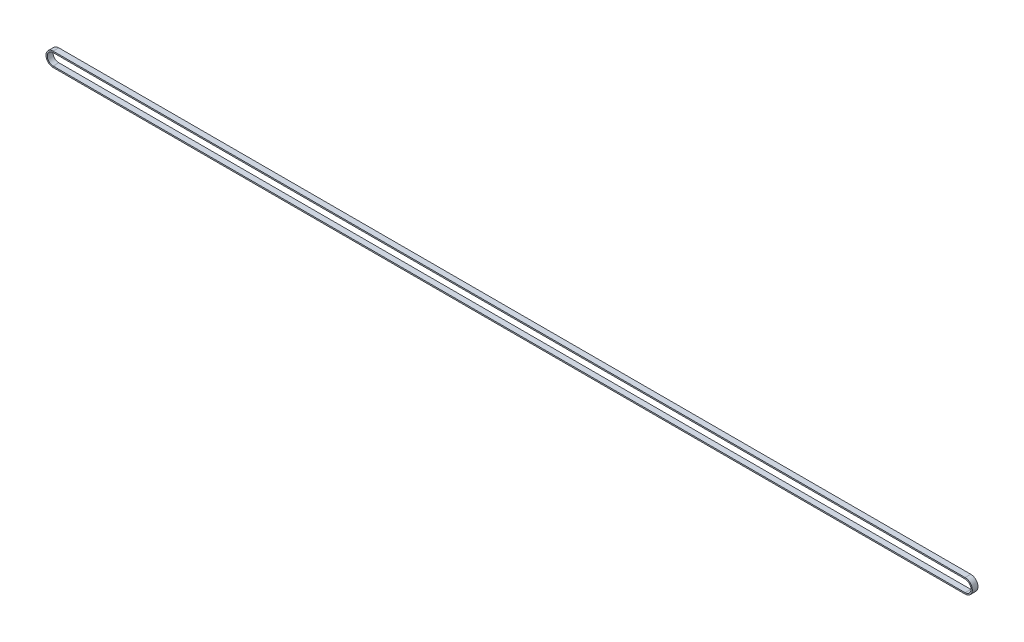
ISO-10303-21;
HEADER;
FILE_DESCRIPTION(('STEP AP214'),'2;1');
FILE_NAME('part.step','',(''),(''),'','','');
FILE_SCHEMA(('AUTOMOTIVE_DESIGN { 1 0 10303 214 1 1 1 1 }'));
ENDSEC;
DATA;
#1=APPLICATION_CONTEXT('core data for automotive mechanical design processes');
#2=APPLICATION_PROTOCOL_DEFINITION('international standard','automotive_design',2000,#1);
#3=PRODUCT_CONTEXT('',#1,'mechanical');
#4=PRODUCT('Part','Part','',(#3));
#5=PRODUCT_RELATED_PRODUCT_CATEGORY('part','',(#4));
#6=PRODUCT_DEFINITION_FORMATION('','',#4);
#7=PRODUCT_DEFINITION_CONTEXT('part definition',#1,'design');
#8=PRODUCT_DEFINITION('design','',#6,#7);
#9=PRODUCT_DEFINITION_SHAPE('','',#8);
#10=(LENGTH_UNIT() NAMED_UNIT(*) SI_UNIT(.MILLI.,.METRE.));
#11=(NAMED_UNIT(*) PLANE_ANGLE_UNIT() SI_UNIT($,.RADIAN.));
#12=(NAMED_UNIT(*) SI_UNIT($,.STERADIAN.) SOLID_ANGLE_UNIT());
#13=UNCERTAINTY_MEASURE_WITH_UNIT(LENGTH_MEASURE(1.E-05),#10,'distance_accuracy_value','');
#14=(GEOMETRIC_REPRESENTATION_CONTEXT(3) GLOBAL_UNCERTAINTY_ASSIGNED_CONTEXT((#13)) GLOBAL_UNIT_ASSIGNED_CONTEXT((#10,
#11,#12)) REPRESENTATION_CONTEXT('',''));
#15=CARTESIAN_POINT('',(0.,0.,0.));
#16=DIRECTION('',(0.,0.,1.));
#17=DIRECTION('',(1.,0.,0.));
#18=AXIS2_PLACEMENT_3D('',#15,#16,#17);
#19=CARTESIAN_POINT('',(9.99200722162641E-13,5.72458747072346E-13,3.));
#20=DIRECTION('',(0.,0.,-1.));
#21=DIRECTION('',(-1.,0.,0.));
#22=AXIS2_PLACEMENT_3D('',#19,#20,#21);
#23=PLANE('',#22);
#24=CARTESIAN_POINT('',(9.99200722162641E-13,5.72458747072346E-13,3.));
#25=DIRECTION('',(0.,0.,1.));
#26=DIRECTION('',(-1.,0.,0.));
#27=AXIS2_PLACEMENT_3D('',#24,#25,#26);
#28=CIRCLE('',#27,7.49);
#29=CARTESIAN_POINT('',(-0.000779396472865312,7.48999995944925,3.));
#30=VERTEX_POINT('',#29);
#31=CARTESIAN_POINT('',(-0.000779396449174424,-7.48999995944811,3.));
#32=VERTEX_POINT('',#31);
#33=EDGE_CURVE('E140',#30,#32,#28,.T.);
#34=ORIENTED_EDGE('',*,*,#33,.T.);
#35=DIRECTION('',(0.999999994585849,-0.000104059126272446,0.));
#36=VECTOR('',#35,1.);
#37=CARTESIAN_POINT('',(960.98348595384,-7.58999914300344,3.));
#38=LINE('',#37,#36);
#39=CARTESIAN_POINT('',(960.98348595384,-7.58999914300344,3.));
#40=VERTEX_POINT('',#39);
#41=EDGE_CURVE('E143',#32,#40,#38,.T.);
#42=ORIENTED_EDGE('',*,*,#41,.T.);
#43=CARTESIAN_POINT('',(960.984275756032,1.52054237256838E-09,3.));
#44=DIRECTION('',(0.,0.,1.));
#45=DIRECTION('',(-1.,0.,0.));
#46=AXIS2_PLACEMENT_3D('',#43,#44,#45);
#47=CIRCLE('',#46,7.58999877468946);
#48=CARTESIAN_POINT('',(960.983485953858,7.58999873511727,3.));
#49=VERTEX_POINT('',#48);
#50=EDGE_CURVE('E146',#40,#49,#47,.T.);
#51=ORIENTED_EDGE('',*,*,#50,.T.);
#52=DIRECTION('',(-0.999999994585938,-0.000104058274214226,0.));
#53=VECTOR('',#52,1.);
#54=CARTESIAN_POINT('',(-0.000779396472865312,7.48999995944925,3.));
#55=LINE('',#54,#53);
#56=EDGE_CURVE('E148',#49,#30,#55,.T.);
#57=ORIENTED_EDGE('',*,*,#56,.T.);
#58=EDGE_LOOP('',(#34,#42,#51,#57));
#59=FACE_BOUND('',#58,.T.);
#60=CARTESIAN_POINT('',(9.99200722162641E-13,5.72458747072346E-13,3.));
#61=DIRECTION('',(0.,0.,1.));
#62=DIRECTION('',(-1.,0.,0.));
#63=AXIS2_PLACEMENT_3D('',#60,#61,#62);
#64=CIRCLE('',#63,6.11);
#65=CARTESIAN_POINT('',(-0.000635796054449721,6.10999996692065,3.));
#66=VERTEX_POINT('',#65);
#67=CARTESIAN_POINT('',(-0.000635796035121573,-6.10999996691951,3.));
#68=VERTEX_POINT('',#67);
#69=EDGE_CURVE('E104',#66,#68,#64,.T.);
#70=ORIENTED_EDGE('',*,*,#69,.F.);
#71=DIRECTION('',(-0.999999994585938,-0.000104058274214226,0.));
#72=VECTOR('',#71,1.);
#73=CARTESIAN_POINT('',(-0.000635796054449721,6.10999996692065,3.));
#74=LINE('',#73,#72);
#75=CARTESIAN_POINT('',(960.983629554319,6.20999833166144,3.));
#76=VERTEX_POINT('',#75);
#77=EDGE_CURVE('E126',#76,#66,#74,.T.);
#78=ORIENTED_EDGE('',*,*,#77,.F.);
#79=CARTESIAN_POINT('',(960.984275756032,1.52054237256838E-09,3.));
#80=DIRECTION('',(0.,0.,1.));
#81=DIRECTION('',(-1.,0.,0.));
#82=AXIS2_PLACEMENT_3D('',#79,#80,#81);
#83=CIRCLE('',#82,6.20999836376221);
#84=CARTESIAN_POINT('',(960.983629554339,-6.20999832862035,3.));
#85=VERTEX_POINT('',#84);
#86=EDGE_CURVE('E124',#85,#76,#83,.T.);
#87=ORIENTED_EDGE('',*,*,#86,.F.);
#88=DIRECTION('',(0.999999994585938,-0.000104058271050866,0.));
#89=VECTOR('',#88,1.);
#90=CARTESIAN_POINT('',(960.983629554339,-6.20999832862035,3.));
#91=LINE('',#90,#89);
#92=EDGE_CURVE('E112',#68,#85,#91,.T.);
#93=ORIENTED_EDGE('',*,*,#92,.F.);
#94=EDGE_LOOP('',(#70,#78,#87,#93));
#95=FACE_BOUND('',#94,.T.);
#96=ADVANCED_FACE('F39',(#59,#95),#23,.F.);
#97=CARTESIAN_POINT('',(9.99200722162641E-13,5.72458747072346E-13,-3.));
#98=DIRECTION('',(0.,0.,-1.));
#99=DIRECTION('',(-1.,0.,0.));
#100=AXIS2_PLACEMENT_3D('',#97,#98,#99);
#101=PLANE('',#100);
#102=CARTESIAN_POINT('',(9.99200722162641E-13,5.72458747072346E-13,-3.));
#103=DIRECTION('',(0.,0.,1.));
#104=DIRECTION('',(-1.,0.,0.));
#105=AXIS2_PLACEMENT_3D('',#102,#103,#104);
#106=CIRCLE('',#105,7.49);
#107=CARTESIAN_POINT('',(-0.000779396472865312,7.48999995944925,-3.));
#108=VERTEX_POINT('',#107);
#109=CARTESIAN_POINT('',(-0.000779396449174424,-7.48999995944811,-3.));
#110=VERTEX_POINT('',#109);
#111=EDGE_CURVE('E120',#108,#110,#106,.T.);
#112=ORIENTED_EDGE('',*,*,#111,.F.);
#113=DIRECTION('',(-0.999999994585938,-0.000104058274214226,0.));
#114=VECTOR('',#113,1.);
#115=CARTESIAN_POINT('',(-0.000779396472865312,7.48999995944925,-3.));
#116=LINE('',#115,#114);
#117=CARTESIAN_POINT('',(960.983485953858,7.58999873511727,-3.));
#118=VERTEX_POINT('',#117);
#119=EDGE_CURVE('E144',#118,#108,#116,.T.);
#120=ORIENTED_EDGE('',*,*,#119,.F.);
#121=CARTESIAN_POINT('',(960.984275756032,1.52054237256838E-09,-3.));
#122=DIRECTION('',(0.,0.,1.));
#123=DIRECTION('',(-1.,0.,0.));
#124=AXIS2_PLACEMENT_3D('',#121,#122,#123);
#125=CIRCLE('',#124,7.58999877468946);
#126=CARTESIAN_POINT('',(960.98348595384,-7.58999914300344,-3.));
#127=VERTEX_POINT('',#126);
#128=EDGE_CURVE('E155',#127,#118,#125,.T.);
#129=ORIENTED_EDGE('',*,*,#128,.F.);
#130=DIRECTION('',(0.999999994585849,-0.000104059126272446,0.));
#131=VECTOR('',#130,1.);
#132=CARTESIAN_POINT('',(960.98348595384,-7.58999914300344,-3.));
#133=LINE('',#132,#131);
#134=EDGE_CURVE('E153',#110,#127,#133,.T.);
#135=ORIENTED_EDGE('',*,*,#134,.F.);
#136=EDGE_LOOP('',(#112,#120,#129,#135));
#137=FACE_BOUND('',#136,.T.);
#138=DIRECTION('',(-0.999999994585938,-0.000104058274214226,0.));
#139=VECTOR('',#138,1.);
#140=CARTESIAN_POINT('',(-0.000635796054449721,6.10999996692065,-3.));
#141=LINE('',#140,#139);
#142=CARTESIAN_POINT('',(960.983629554319,6.20999833166144,-3.));
#143=VERTEX_POINT('',#142);
#144=CARTESIAN_POINT('',(-0.000635796054449721,6.10999996692065,-3.));
#145=VERTEX_POINT('',#144);
#146=EDGE_CURVE('E113',#143,#145,#141,.T.);
#147=ORIENTED_EDGE('',*,*,#146,.T.);
#148=CARTESIAN_POINT('',(9.99200722162641E-13,5.72458747072346E-13,-3.));
#149=DIRECTION('',(0.,0.,1.));
#150=DIRECTION('',(-1.,0.,0.));
#151=AXIS2_PLACEMENT_3D('',#148,#149,#150);
#152=CIRCLE('',#151,6.11);
#153=CARTESIAN_POINT('',(-0.000635796035121573,-6.10999996691951,-3.));
#154=VERTEX_POINT('',#153);
#155=EDGE_CURVE('E62',#145,#154,#152,.T.);
#156=ORIENTED_EDGE('',*,*,#155,.T.);
#157=DIRECTION('',(0.999999994585938,-0.000104058271050866,0.));
#158=VECTOR('',#157,1.);
#159=CARTESIAN_POINT('',(960.983629554339,-6.20999832862035,-3.));
#160=LINE('',#159,#158);
#161=CARTESIAN_POINT('',(960.983629554339,-6.20999832862035,-3.));
#162=VERTEX_POINT('',#161);
#163=EDGE_CURVE('E119',#154,#162,#160,.T.);
#164=ORIENTED_EDGE('',*,*,#163,.T.);
#165=CARTESIAN_POINT('',(960.984275756032,1.52054237256838E-09,-3.));
#166=DIRECTION('',(0.,0.,1.));
#167=DIRECTION('',(-1.,0.,0.));
#168=AXIS2_PLACEMENT_3D('',#165,#166,#167);
#169=CIRCLE('',#168,6.20999836376221);
#170=EDGE_CURVE('E132',#162,#143,#169,.T.);
#171=ORIENTED_EDGE('',*,*,#170,.T.);
#172=EDGE_LOOP('',(#147,#156,#164,#171));
#173=FACE_BOUND('',#172,.T.);
#174=ADVANCED_FACE('F173',(#137,#173),#101,.T.);
#175=CARTESIAN_POINT('',(9.99200722162641E-13,5.72458747072346E-13,3.));
#176=DIRECTION('',(0.,0.,-1.));
#177=DIRECTION('',(-1.,0.,0.));
#178=AXIS2_PLACEMENT_3D('',#175,#176,#177);
#179=CYLINDRICAL_SURFACE('',#178,7.49);
#180=ORIENTED_EDGE('',*,*,#111,.T.);
#181=DIRECTION('',(0.,0.,-1.));
#182=VECTOR('',#181,1.);
#183=CARTESIAN_POINT('',(-0.000779396449174424,-7.48999995944811,3.));
#184=LINE('',#183,#182);
#185=EDGE_CURVE('E11',#32,#110,#184,.T.);
#186=ORIENTED_EDGE('',*,*,#185,.F.);
#187=ORIENTED_EDGE('',*,*,#33,.F.);
#188=DIRECTION('',(0.,0.,-1.));
#189=VECTOR('',#188,1.);
#190=CARTESIAN_POINT('',(-0.000779396472865312,7.48999995944925,3.));
#191=LINE('',#190,#189);
#192=EDGE_CURVE('E150',#30,#108,#191,.T.);
#193=ORIENTED_EDGE('',*,*,#192,.T.);
#194=EDGE_LOOP('',(#180,#186,#187,#193));
#195=FACE_BOUND('',#194,.T.);
#196=ADVANCED_FACE('F41',(#195),#179,.T.);
#197=CARTESIAN_POINT('',(960.98348595384,-7.58999914300344,3.));
#198=DIRECTION('',(0.000104059126272446,0.999999994585849,0.));
#199=DIRECTION('',(-0.999999994585849,0.000104059126272446,0.));
#200=AXIS2_PLACEMENT_3D('',#197,#198,#199);
#201=PLANE('',#200);
#202=ORIENTED_EDGE('',*,*,#134,.T.);
#203=DIRECTION('',(0.,0.,-1.));
#204=VECTOR('',#203,1.);
#205=CARTESIAN_POINT('',(960.98348595384,-7.58999914300344,3.));
#206=LINE('',#205,#204);
#207=EDGE_CURVE('E47',#40,#127,#206,.T.);
#208=ORIENTED_EDGE('',*,*,#207,.F.);
#209=ORIENTED_EDGE('',*,*,#41,.F.);
#210=ORIENTED_EDGE('',*,*,#185,.T.);
#211=EDGE_LOOP('',(#202,#208,#209,#210));
#212=FACE_BOUND('',#211,.T.);
#213=ADVANCED_FACE('F183',(#212),#201,.F.);
#214=CARTESIAN_POINT('',(960.984275756032,1.52054237256838E-09,3.));
#215=DIRECTION('',(0.,0.,-1.));
#216=DIRECTION('',(-1.,0.,0.));
#217=AXIS2_PLACEMENT_3D('',#214,#215,#216);
#218=CYLINDRICAL_SURFACE('',#217,7.58999877468946);
#219=ORIENTED_EDGE('',*,*,#128,.T.);
#220=DIRECTION('',(0.,0.,-1.));
#221=VECTOR('',#220,1.);
#222=CARTESIAN_POINT('',(960.983485953858,7.58999873511727,3.));
#223=LINE('',#222,#221);
#224=EDGE_CURVE('E160',#49,#118,#223,.T.);
#225=ORIENTED_EDGE('',*,*,#224,.F.);
#226=ORIENTED_EDGE('',*,*,#50,.F.);
#227=ORIENTED_EDGE('',*,*,#207,.T.);
#228=EDGE_LOOP('',(#219,#225,#226,#227));
#229=FACE_BOUND('',#228,.T.);
#230=ADVANCED_FACE('F167',(#229),#218,.T.);
#231=CARTESIAN_POINT('',(-0.000779396472865312,7.48999995944925,3.));
#232=DIRECTION('',(0.000104058274214226,-0.999999994585938,0.));
#233=DIRECTION('',(0.999999994585938,0.000104058274214226,0.));
#234=AXIS2_PLACEMENT_3D('',#231,#232,#233);
#235=PLANE('',#234);
#236=ORIENTED_EDGE('',*,*,#119,.T.);
#237=ORIENTED_EDGE('',*,*,#192,.F.);
#238=ORIENTED_EDGE('',*,*,#56,.F.);
#239=ORIENTED_EDGE('',*,*,#224,.T.);
#240=EDGE_LOOP('',(#236,#237,#238,#239));
#241=FACE_BOUND('',#240,.T.);
#242=ADVANCED_FACE('F177',(#241),#235,.F.);
#243=CARTESIAN_POINT('',(9.99200722162641E-13,5.72458747072346E-13,3.));
#244=DIRECTION('',(0.,0.,-1.));
#245=DIRECTION('',(-1.,0.,0.));
#246=AXIS2_PLACEMENT_3D('',#243,#244,#245);
#247=CYLINDRICAL_SURFACE('',#246,6.11);
#248=ORIENTED_EDGE('',*,*,#155,.F.);
#249=DIRECTION('',(0.,0.,-1.));
#250=VECTOR('',#249,1.);
#251=CARTESIAN_POINT('',(-0.000635796054449721,6.10999996692065,3.));
#252=LINE('',#251,#250);
#253=EDGE_CURVE('E108',#66,#145,#252,.T.);
#254=ORIENTED_EDGE('',*,*,#253,.F.);
#255=ORIENTED_EDGE('',*,*,#69,.T.);
#256=DIRECTION('',(0.,0.,-1.));
#257=VECTOR('',#256,1.);
#258=CARTESIAN_POINT('',(-0.000635796035121573,-6.10999996691951,3.));
#259=LINE('',#258,#257);
#260=EDGE_CURVE('E107',#68,#154,#259,.T.);
#261=ORIENTED_EDGE('',*,*,#260,.T.);
#262=EDGE_LOOP('',(#248,#254,#255,#261));
#263=FACE_BOUND('',#262,.T.);
#264=ADVANCED_FACE('F106',(#263),#247,.F.);
#265=CARTESIAN_POINT('',(960.983629554339,-6.20999832862035,3.));
#266=DIRECTION('',(0.000104058271050866,0.999999994585938,0.));
#267=DIRECTION('',(-0.999999994585938,0.000104058271050866,0.));
#268=AXIS2_PLACEMENT_3D('',#265,#266,#267);
#269=PLANE('',#268);
#270=ORIENTED_EDGE('',*,*,#163,.F.);
#271=ORIENTED_EDGE('',*,*,#260,.F.);
#272=ORIENTED_EDGE('',*,*,#92,.T.);
#273=DIRECTION('',(0.,0.,-1.));
#274=VECTOR('',#273,1.);
#275=CARTESIAN_POINT('',(960.983629554339,-6.20999832862035,3.));
#276=LINE('',#275,#274);
#277=EDGE_CURVE('E121',#85,#162,#276,.T.);
#278=ORIENTED_EDGE('',*,*,#277,.T.);
#279=EDGE_LOOP('',(#270,#271,#272,#278));
#280=FACE_BOUND('',#279,.T.);
#281=ADVANCED_FACE('F116',(#280),#269,.T.);
#282=CARTESIAN_POINT('',(960.984275756032,1.52054237256838E-09,3.));
#283=DIRECTION('',(0.,0.,-1.));
#284=DIRECTION('',(-1.,0.,0.));
#285=AXIS2_PLACEMENT_3D('',#282,#283,#284);
#286=CYLINDRICAL_SURFACE('',#285,6.20999836376221);
#287=ORIENTED_EDGE('',*,*,#170,.F.);
#288=ORIENTED_EDGE('',*,*,#277,.F.);
#289=ORIENTED_EDGE('',*,*,#86,.T.);
#290=DIRECTION('',(0.,0.,-1.));
#291=VECTOR('',#290,1.);
#292=CARTESIAN_POINT('',(960.983629554319,6.20999833166144,3.));
#293=LINE('',#292,#291);
#294=EDGE_CURVE('E54',#76,#143,#293,.T.);
#295=ORIENTED_EDGE('',*,*,#294,.T.);
#296=EDGE_LOOP('',(#287,#288,#289,#295));
#297=FACE_BOUND('',#296,.T.);
#298=ADVANCED_FACE('F206',(#297),#286,.F.);
#299=CARTESIAN_POINT('',(-0.000635796054449721,6.10999996692065,3.));
#300=DIRECTION('',(0.000104058274214226,-0.999999994585938,0.));
#301=DIRECTION('',(0.999999994585938,0.000104058274214226,0.));
#302=AXIS2_PLACEMENT_3D('',#299,#300,#301);
#303=PLANE('',#302);
#304=ORIENTED_EDGE('',*,*,#146,.F.);
#305=ORIENTED_EDGE('',*,*,#294,.F.);
#306=ORIENTED_EDGE('',*,*,#77,.T.);
#307=ORIENTED_EDGE('',*,*,#253,.T.);
#308=EDGE_LOOP('',(#304,#305,#306,#307));
#309=FACE_BOUND('',#308,.T.);
#310=ADVANCED_FACE('F210',(#309),#303,.T.);
#311=CLOSED_SHELL('',(#96,#174,#196,#213,#230,#242,#264,#281,#298,#310));
#312=MANIFOLD_SOLID_BREP('B2',#311);
#313=ADVANCED_BREP_SHAPE_REPRESENTATION('',(#18,#312),#14);
#314=SHAPE_DEFINITION_REPRESENTATION(#9,#313);
ENDSEC;
END-ISO-10303-21;
